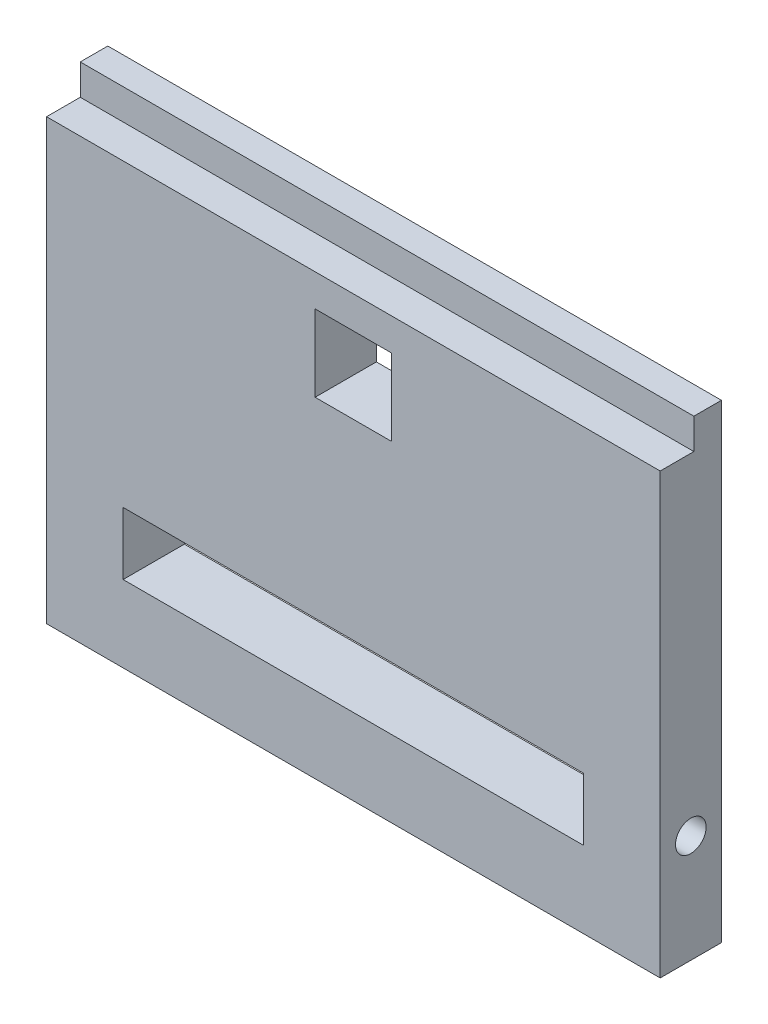
ISO-10303-21;
HEADER;
FILE_DESCRIPTION(('STEP AP214'),'2;1');
FILE_NAME('part.step','',(''),(''),'','','');
FILE_SCHEMA(('AUTOMOTIVE_DESIGN { 1 0 10303 214 1 1 1 1 }'));
ENDSEC;
DATA;
#1=APPLICATION_CONTEXT('core data for automotive mechanical design processes');
#2=APPLICATION_PROTOCOL_DEFINITION('international standard','automotive_design',2000,#1);
#3=PRODUCT_CONTEXT('',#1,'mechanical');
#4=PRODUCT('Part','Part','',(#3));
#5=PRODUCT_RELATED_PRODUCT_CATEGORY('part','',(#4));
#6=PRODUCT_DEFINITION_FORMATION('','',#4);
#7=PRODUCT_DEFINITION_CONTEXT('part definition',#1,'design');
#8=PRODUCT_DEFINITION('design','',#6,#7);
#9=PRODUCT_DEFINITION_SHAPE('','',#8);
#10=(LENGTH_UNIT() NAMED_UNIT(*) SI_UNIT(.MILLI.,.METRE.));
#11=(NAMED_UNIT(*) PLANE_ANGLE_UNIT() SI_UNIT($,.RADIAN.));
#12=(NAMED_UNIT(*) SI_UNIT($,.STERADIAN.) SOLID_ANGLE_UNIT());
#13=UNCERTAINTY_MEASURE_WITH_UNIT(LENGTH_MEASURE(1.E-05),#10,'distance_accuracy_value','');
#14=(GEOMETRIC_REPRESENTATION_CONTEXT(3) GLOBAL_UNCERTAINTY_ASSIGNED_CONTEXT((#13)) GLOBAL_UNIT_ASSIGNED_CONTEXT((#10,
#11,#12)) REPRESENTATION_CONTEXT('',''));
#15=CARTESIAN_POINT('',(0.,0.,0.));
#16=DIRECTION('',(0.,0.,1.));
#17=DIRECTION('',(1.,0.,0.));
#18=AXIS2_PLACEMENT_3D('',#15,#16,#17);
#19=CARTESIAN_POINT('',(0.,0.,10.));
#20=DIRECTION('',(0.,0.,1.));
#21=DIRECTION('',(1.,0.,0.));
#22=AXIS2_PLACEMENT_3D('',#19,#20,#21);
#23=PLANE('',#22);
#24=DIRECTION('',(1.,0.,0.));
#25=VECTOR('',#24,1.);
#26=CARTESIAN_POINT('',(-100.2,108.2,10.));
#27=LINE('',#26,#25);
#28=CARTESIAN_POINT('',(-100.2,108.2,10.));
#29=VERTEX_POINT('',#28);
#30=CARTESIAN_POINT('',(100.2,108.2,10.));
#31=VERTEX_POINT('',#30);
#32=EDGE_CURVE('E149',#29,#31,#27,.T.);
#33=ORIENTED_EDGE('',*,*,#32,.F.);
#34=DIRECTION('',(0.,-1.,0.));
#35=VECTOR('',#34,1.);
#36=CARTESIAN_POINT('',(-100.2,-35.2,10.));
#37=LINE('',#36,#35);
#38=CARTESIAN_POINT('',(-100.2,-35.2,10.));
#39=VERTEX_POINT('',#38);
#40=EDGE_CURVE('E236',#29,#39,#37,.T.);
#41=ORIENTED_EDGE('',*,*,#40,.T.);
#42=DIRECTION('',(1.,0.,0.));
#43=VECTOR('',#42,1.);
#44=CARTESIAN_POINT('',(-100.2,-35.2,10.));
#45=LINE('',#44,#43);
#46=CARTESIAN_POINT('',(100.2,-35.2,10.));
#47=VERTEX_POINT('',#46);
#48=EDGE_CURVE('E230',#39,#47,#45,.T.);
#49=ORIENTED_EDGE('',*,*,#48,.T.);
#50=DIRECTION('',(0.,1.,0.));
#51=VECTOR('',#50,1.);
#52=CARTESIAN_POINT('',(100.2,-35.2,10.));
#53=LINE('',#52,#51);
#54=EDGE_CURVE('E233',#47,#31,#53,.T.);
#55=ORIENTED_EDGE('',*,*,#54,.T.);
#56=EDGE_LOOP('',(#33,#41,#49,#55));
#57=FACE_BOUND('',#56,.T.);
#58=DIRECTION('',(0.,1.,0.));
#59=VECTOR('',#58,1.);
#60=CARTESIAN_POINT('',(12.5,0.,10.));
#61=LINE('',#60,#59);
#62=CARTESIAN_POINT('',(12.5,72.7000000000001,10.));
#63=VERTEX_POINT('',#62);
#64=CARTESIAN_POINT('',(12.5,97.7000000000001,10.));
#65=VERTEX_POINT('',#64);
#66=EDGE_CURVE('E190',#63,#65,#61,.T.);
#67=ORIENTED_EDGE('',*,*,#66,.F.);
#68=DIRECTION('',(1.,0.,0.));
#69=VECTOR('',#68,1.);
#70=CARTESIAN_POINT('',(0.,72.7000000000001,10.));
#71=LINE('',#70,#69);
#72=CARTESIAN_POINT('',(-12.5,72.7000000000001,10.));
#73=VERTEX_POINT('',#72);
#74=EDGE_CURVE('E188',#73,#63,#71,.T.);
#75=ORIENTED_EDGE('',*,*,#74,.F.);
#76=DIRECTION('',(0.,-1.,0.));
#77=VECTOR('',#76,1.);
#78=CARTESIAN_POINT('',(-12.5,0.,10.));
#79=LINE('',#78,#77);
#80=CARTESIAN_POINT('',(-12.5,97.7000000000001,10.));
#81=VERTEX_POINT('',#80);
#82=EDGE_CURVE('E186',#81,#73,#79,.T.);
#83=ORIENTED_EDGE('',*,*,#82,.F.);
#84=DIRECTION('',(-1.,0.,0.));
#85=VECTOR('',#84,1.);
#86=CARTESIAN_POINT('',(0.,97.7000000000001,10.));
#87=LINE('',#86,#85);
#88=EDGE_CURVE('E177',#65,#81,#87,.T.);
#89=ORIENTED_EDGE('',*,*,#88,.F.);
#90=EDGE_LOOP('',(#67,#75,#83,#89));
#91=FACE_BOUND('',#90,.T.);
#92=DIRECTION('',(1.,0.,0.));
#93=VECTOR('',#92,1.);
#94=CARTESIAN_POINT('',(-75.2,-10.2,10.));
#95=LINE('',#94,#93);
#96=CARTESIAN_POINT('',(-75.2,-10.2,10.));
#97=VERTEX_POINT('',#96);
#98=CARTESIAN_POINT('',(75.2,-10.2,10.));
#99=VERTEX_POINT('',#98);
#100=EDGE_CURVE('E201',#97,#99,#95,.T.);
#101=ORIENTED_EDGE('',*,*,#100,.F.);
#102=DIRECTION('',(0.,-1.,0.));
#103=VECTOR('',#102,1.);
#104=CARTESIAN_POINT('',(-75.2,-10.2,10.));
#105=LINE('',#104,#103);
#106=CARTESIAN_POINT('',(-75.2,10.2,10.));
#107=VERTEX_POINT('',#106);
#108=EDGE_CURVE('E199',#107,#97,#105,.T.);
#109=ORIENTED_EDGE('',*,*,#108,.F.);
#110=DIRECTION('',(-1.,0.,0.));
#111=VECTOR('',#110,1.);
#112=CARTESIAN_POINT('',(-75.2,10.2,10.));
#113=LINE('',#112,#111);
#114=CARTESIAN_POINT('',(75.2,10.2,10.));
#115=VERTEX_POINT('',#114);
#116=EDGE_CURVE('E207',#115,#107,#113,.T.);
#117=ORIENTED_EDGE('',*,*,#116,.F.);
#118=DIRECTION('',(0.,1.,0.));
#119=VECTOR('',#118,1.);
#120=CARTESIAN_POINT('',(75.2,-10.2,10.));
#121=LINE('',#120,#119);
#122=EDGE_CURVE('E204',#99,#115,#121,.T.);
#123=ORIENTED_EDGE('',*,*,#122,.F.);
#124=EDGE_LOOP('',(#101,#109,#117,#123));
#125=FACE_BOUND('',#124,.T.);
#126=ADVANCED_FACE('F37',(#57,#91,#125),#23,.T.);
#127=CARTESIAN_POINT('',(0.,0.,-10.));
#128=DIRECTION('',(0.,0.,1.));
#129=DIRECTION('',(1.,0.,0.));
#130=AXIS2_PLACEMENT_3D('',#127,#128,#129);
#131=PLANE('',#130);
#132=DIRECTION('',(1.,0.,0.));
#133=VECTOR('',#132,1.);
#134=CARTESIAN_POINT('',(-12.5,72.7000000000001,-10.));
#135=LINE('',#134,#133);
#136=CARTESIAN_POINT('',(-12.5,72.7000000000001,-10.));
#137=VERTEX_POINT('',#136);
#138=CARTESIAN_POINT('',(12.5,72.7000000000001,-10.));
#139=VERTEX_POINT('',#138);
#140=EDGE_CURVE('E171',#137,#139,#135,.T.);
#141=ORIENTED_EDGE('',*,*,#140,.T.);
#142=DIRECTION('',(0.,1.,0.));
#143=VECTOR('',#142,1.);
#144=CARTESIAN_POINT('',(12.5,72.7000000000001,-10.));
#145=LINE('',#144,#143);
#146=CARTESIAN_POINT('',(12.5,97.7000000000001,-10.));
#147=VERTEX_POINT('',#146);
#148=EDGE_CURVE('E158',#139,#147,#145,.T.);
#149=ORIENTED_EDGE('',*,*,#148,.T.);
#150=DIRECTION('',(-1.,0.,0.));
#151=VECTOR('',#150,1.);
#152=CARTESIAN_POINT('',(12.5,97.7000000000001,-10.));
#153=LINE('',#152,#151);
#154=CARTESIAN_POINT('',(-12.5,97.7000000000001,-10.));
#155=VERTEX_POINT('',#154);
#156=EDGE_CURVE('E165',#147,#155,#153,.T.);
#157=ORIENTED_EDGE('',*,*,#156,.T.);
#158=DIRECTION('',(0.,-1.,0.));
#159=VECTOR('',#158,1.);
#160=CARTESIAN_POINT('',(-12.5,97.7000000000001,-10.));
#161=LINE('',#160,#159);
#162=EDGE_CURVE('E168',#155,#137,#161,.T.);
#163=ORIENTED_EDGE('',*,*,#162,.T.);
#164=EDGE_LOOP('',(#141,#149,#157,#163));
#165=FACE_BOUND('',#164,.T.);
#166=DIRECTION('',(1.,0.,0.));
#167=VECTOR('',#166,1.);
#168=CARTESIAN_POINT('',(-100.2,-35.2,-10.));
#169=LINE('',#168,#167);
#170=CARTESIAN_POINT('',(-100.2,-35.2,-10.));
#171=VERTEX_POINT('',#170);
#172=CARTESIAN_POINT('',(100.2,-35.2,-10.));
#173=VERTEX_POINT('',#172);
#174=EDGE_CURVE('E229',#171,#173,#169,.T.);
#175=ORIENTED_EDGE('',*,*,#174,.F.);
#176=DIRECTION('',(0.,-1.,0.));
#177=VECTOR('',#176,1.);
#178=CARTESIAN_POINT('',(-100.2,-35.2,-10.));
#179=LINE('',#178,#177);
#180=CARTESIAN_POINT('',(-100.2,118.2,-10.));
#181=VERTEX_POINT('',#180);
#182=EDGE_CURVE('E234',#181,#171,#179,.T.);
#183=ORIENTED_EDGE('',*,*,#182,.F.);
#184=DIRECTION('',(-1.,0.,0.));
#185=VECTOR('',#184,1.);
#186=CARTESIAN_POINT('',(-100.2,118.2,-10.));
#187=LINE('',#186,#185);
#188=CARTESIAN_POINT('',(100.2,118.2,-10.));
#189=VERTEX_POINT('',#188);
#190=EDGE_CURVE('E243',#189,#181,#187,.T.);
#191=ORIENTED_EDGE('',*,*,#190,.F.);
#192=DIRECTION('',(0.,1.,0.));
#193=VECTOR('',#192,1.);
#194=CARTESIAN_POINT('',(100.2,-35.2,-10.));
#195=LINE('',#194,#193);
#196=EDGE_CURVE('E241',#173,#189,#195,.T.);
#197=ORIENTED_EDGE('',*,*,#196,.F.);
#198=EDGE_LOOP('',(#175,#183,#191,#197));
#199=FACE_BOUND('',#198,.T.);
#200=DIRECTION('',(0.,-1.,0.));
#201=VECTOR('',#200,1.);
#202=CARTESIAN_POINT('',(-75.2,-10.2,-10.));
#203=LINE('',#202,#201);
#204=CARTESIAN_POINT('',(-75.2,10.2,-10.));
#205=VERTEX_POINT('',#204);
#206=CARTESIAN_POINT('',(-75.2,-10.2,-10.));
#207=VERTEX_POINT('',#206);
#208=EDGE_CURVE('E196',#205,#207,#203,.T.);
#209=ORIENTED_EDGE('',*,*,#208,.T.);
#210=DIRECTION('',(1.,0.,0.));
#211=VECTOR('',#210,1.);
#212=CARTESIAN_POINT('',(-75.2,-10.2,-10.));
#213=LINE('',#212,#211);
#214=CARTESIAN_POINT('',(75.2,-10.2,-10.));
#215=VERTEX_POINT('',#214);
#216=EDGE_CURVE('E212',#207,#215,#213,.T.);
#217=ORIENTED_EDGE('',*,*,#216,.T.);
#218=DIRECTION('',(0.,1.,0.));
#219=VECTOR('',#218,1.);
#220=CARTESIAN_POINT('',(75.2,-10.2,-10.));
#221=LINE('',#220,#219);
#222=CARTESIAN_POINT('',(75.2,10.2,-10.));
#223=VERTEX_POINT('',#222);
#224=EDGE_CURVE('E215',#215,#223,#221,.T.);
#225=ORIENTED_EDGE('',*,*,#224,.T.);
#226=DIRECTION('',(-1.,0.,0.));
#227=VECTOR('',#226,1.);
#228=CARTESIAN_POINT('',(-75.2,10.2,-10.));
#229=LINE('',#228,#227);
#230=EDGE_CURVE('E202',#223,#205,#229,.T.);
#231=ORIENTED_EDGE('',*,*,#230,.T.);
#232=EDGE_LOOP('',(#209,#217,#225,#231));
#233=FACE_BOUND('',#232,.T.);
#234=ADVANCED_FACE('F258',(#165,#199,#233),#131,.F.);
#235=CARTESIAN_POINT('',(-100.2,-35.2,10.));
#236=DIRECTION('',(0.,1.,0.));
#237=DIRECTION('',(0.,0.,1.));
#238=AXIS2_PLACEMENT_3D('',#235,#236,#237);
#239=PLANE('',#238);
#240=ORIENTED_EDGE('',*,*,#174,.T.);
#241=DIRECTION('',(0.,0.,-1.));
#242=VECTOR('',#241,1.);
#243=CARTESIAN_POINT('',(100.2,-35.2,10.));
#244=LINE('',#243,#242);
#245=EDGE_CURVE('E12',#47,#173,#244,.T.);
#246=ORIENTED_EDGE('',*,*,#245,.F.);
#247=ORIENTED_EDGE('',*,*,#48,.F.);
#248=DIRECTION('',(0.,0.,-1.));
#249=VECTOR('',#248,1.);
#250=CARTESIAN_POINT('',(-100.2,-35.2,10.));
#251=LINE('',#250,#249);
#252=EDGE_CURVE('E238',#39,#171,#251,.T.);
#253=ORIENTED_EDGE('',*,*,#252,.T.);
#254=EDGE_LOOP('',(#240,#246,#247,#253));
#255=FACE_BOUND('',#254,.T.);
#256=ADVANCED_FACE('F39',(#255),#239,.F.);
#257=CARTESIAN_POINT('',(100.2,-35.2,10.));
#258=DIRECTION('',(-1.,0.,0.));
#259=DIRECTION('',(0.,0.,1.));
#260=AXIS2_PLACEMENT_3D('',#257,#258,#259);
#261=PLANE('',#260);
#262=CARTESIAN_POINT('',(100.2,0.,0.));
#263=DIRECTION('',(1.,0.,0.));
#264=DIRECTION('',(0.,0.,-1.));
#265=AXIS2_PLACEMENT_3D('',#262,#263,#264);
#266=CIRCLE('',#265,5.);
#267=CARTESIAN_POINT('',(100.2,0.,-5.));
#268=VERTEX_POINT('',#267);
#269=EDGE_CURVE('E193',#268,#268,#266,.T.);
#270=ORIENTED_EDGE('',*,*,#269,.F.);
#271=EDGE_LOOP('',(#270));
#272=FACE_BOUND('',#271,.T.);
#273=DIRECTION('',(0.,0.,-1.));
#274=VECTOR('',#273,1.);
#275=CARTESIAN_POINT('',(100.2,118.2,10.));
#276=LINE('',#275,#274);
#277=CARTESIAN_POINT('',(100.2,118.2,-0.999999999999977));
#278=VERTEX_POINT('',#277);
#279=EDGE_CURVE('E45',#278,#189,#276,.T.);
#280=ORIENTED_EDGE('',*,*,#279,.F.);
#281=DIRECTION('',(0.,1.,0.));
#282=VECTOR('',#281,1.);
#283=CARTESIAN_POINT('',(100.2,108.2,-0.999999999999977));
#284=LINE('',#283,#282);
#285=CARTESIAN_POINT('',(100.2,108.2,-0.999999999999977));
#286=VERTEX_POINT('',#285);
#287=EDGE_CURVE('E138',#286,#278,#284,.T.);
#288=ORIENTED_EDGE('',*,*,#287,.F.);
#289=DIRECTION('',(0.,0.,-1.));
#290=VECTOR('',#289,1.);
#291=CARTESIAN_POINT('',(100.2,108.2,10.));
#292=LINE('',#291,#290);
#293=EDGE_CURVE('E144',#31,#286,#292,.T.);
#294=ORIENTED_EDGE('',*,*,#293,.F.);
#295=ORIENTED_EDGE('',*,*,#54,.F.);
#296=ORIENTED_EDGE('',*,*,#245,.T.);
#297=ORIENTED_EDGE('',*,*,#196,.T.);
#298=EDGE_LOOP('',(#280,#288,#294,#295,#296,#297));
#299=FACE_BOUND('',#298,.T.);
#300=ADVANCED_FACE('F155',(#272,#299),#261,.F.);
#301=CARTESIAN_POINT('',(-100.2,118.2,10.));
#302=DIRECTION('',(0.,-1.,0.));
#303=DIRECTION('',(0.,0.,-1.));
#304=AXIS2_PLACEMENT_3D('',#301,#302,#303);
#305=PLANE('',#304);
#306=DIRECTION('',(0.,0.,-1.));
#307=VECTOR('',#306,1.);
#308=CARTESIAN_POINT('',(-100.2,118.2,10.));
#309=LINE('',#308,#307);
#310=CARTESIAN_POINT('',(-100.2,118.2,-0.999999999999977));
#311=VERTEX_POINT('',#310);
#312=EDGE_CURVE('E249',#311,#181,#309,.T.);
#313=ORIENTED_EDGE('',*,*,#312,.F.);
#314=DIRECTION('',(-1.,0.,0.));
#315=VECTOR('',#314,1.);
#316=CARTESIAN_POINT('',(-100.2,118.2,-0.999999999999977));
#317=LINE('',#316,#315);
#318=EDGE_CURVE('E152',#278,#311,#317,.T.);
#319=ORIENTED_EDGE('',*,*,#318,.F.);
#320=ORIENTED_EDGE('',*,*,#279,.T.);
#321=ORIENTED_EDGE('',*,*,#190,.T.);
#322=EDGE_LOOP('',(#313,#319,#320,#321));
#323=FACE_BOUND('',#322,.T.);
#324=ADVANCED_FACE('F252',(#323),#305,.F.);
#325=CARTESIAN_POINT('',(-100.2,-35.2,10.));
#326=DIRECTION('',(1.,0.,0.));
#327=DIRECTION('',(0.,0.,-1.));
#328=AXIS2_PLACEMENT_3D('',#325,#326,#327);
#329=PLANE('',#328);
#330=DIRECTION('',(0.,0.,1.));
#331=VECTOR('',#330,1.);
#332=CARTESIAN_POINT('',(-100.2,108.2,10.));
#333=LINE('',#332,#331);
#334=CARTESIAN_POINT('',(-100.2,108.2,-0.999999999999977));
#335=VERTEX_POINT('',#334);
#336=EDGE_CURVE('E143',#335,#29,#333,.T.);
#337=ORIENTED_EDGE('',*,*,#336,.F.);
#338=DIRECTION('',(0.,1.,0.));
#339=VECTOR('',#338,1.);
#340=CARTESIAN_POINT('',(-100.2,108.2,-0.999999999999977));
#341=LINE('',#340,#339);
#342=EDGE_CURVE('E141',#335,#311,#341,.T.);
#343=ORIENTED_EDGE('',*,*,#342,.T.);
#344=ORIENTED_EDGE('',*,*,#312,.T.);
#345=ORIENTED_EDGE('',*,*,#182,.T.);
#346=ORIENTED_EDGE('',*,*,#252,.F.);
#347=ORIENTED_EDGE('',*,*,#40,.F.);
#348=EDGE_LOOP('',(#337,#343,#344,#345,#346,#347));
#349=FACE_BOUND('',#348,.T.);
#350=ADVANCED_FACE('F262',(#349),#329,.F.);
#351=CARTESIAN_POINT('',(-75.2,-10.2,10.));
#352=DIRECTION('',(1.,0.,0.));
#353=DIRECTION('',(0.,0.,-1.));
#354=AXIS2_PLACEMENT_3D('',#351,#352,#353);
#355=PLANE('',#354);
#356=ORIENTED_EDGE('',*,*,#208,.F.);
#357=DIRECTION('',(0.,0.,-1.));
#358=VECTOR('',#357,1.);
#359=CARTESIAN_POINT('',(-75.2,10.2,10.));
#360=LINE('',#359,#358);
#361=EDGE_CURVE('E209',#107,#205,#360,.T.);
#362=ORIENTED_EDGE('',*,*,#361,.F.);
#363=ORIENTED_EDGE('',*,*,#108,.T.);
#364=DIRECTION('',(0.,0.,-1.));
#365=VECTOR('',#364,1.);
#366=CARTESIAN_POINT('',(-75.2,-10.2,10.));
#367=LINE('',#366,#365);
#368=EDGE_CURVE('E226',#97,#207,#367,.T.);
#369=ORIENTED_EDGE('',*,*,#368,.T.);
#370=EDGE_LOOP('',(#356,#362,#363,#369));
#371=FACE_BOUND('',#370,.T.);
#372=ADVANCED_FACE('F288',(#371),#355,.T.);
#373=CARTESIAN_POINT('',(-75.2,-10.2,10.));
#374=DIRECTION('',(0.,1.,0.));
#375=DIRECTION('',(0.,0.,1.));
#376=AXIS2_PLACEMENT_3D('',#373,#374,#375);
#377=PLANE('',#376);
#378=ORIENTED_EDGE('',*,*,#216,.F.);
#379=ORIENTED_EDGE('',*,*,#368,.F.);
#380=ORIENTED_EDGE('',*,*,#100,.T.);
#381=DIRECTION('',(0.,0.,-1.));
#382=VECTOR('',#381,1.);
#383=CARTESIAN_POINT('',(75.2,-10.2,10.));
#384=LINE('',#383,#382);
#385=EDGE_CURVE('E224',#99,#215,#384,.T.);
#386=ORIENTED_EDGE('',*,*,#385,.T.);
#387=EDGE_LOOP('',(#378,#379,#380,#386));
#388=FACE_BOUND('',#387,.T.);
#389=ADVANCED_FACE('F282',(#388),#377,.T.);
#390=CARTESIAN_POINT('',(75.2,-10.2,10.));
#391=DIRECTION('',(-1.,0.,0.));
#392=DIRECTION('',(0.,0.,1.));
#393=AXIS2_PLACEMENT_3D('',#390,#391,#392);
#394=PLANE('',#393);
#395=CARTESIAN_POINT('',(75.2,0.,0.));
#396=DIRECTION('',(-1.,0.,0.));
#397=DIRECTION('',(0.,0.,1.));
#398=AXIS2_PLACEMENT_3D('',#395,#396,#397);
#399=CIRCLE('',#398,5.);
#400=CARTESIAN_POINT('',(75.2,0.,5.));
#401=VERTEX_POINT('',#400);
#402=EDGE_CURVE('E192',#401,#401,#399,.F.);
#403=ORIENTED_EDGE('',*,*,#402,.T.);
#404=EDGE_LOOP('',(#403));
#405=FACE_BOUND('',#404,.T.);
#406=ORIENTED_EDGE('',*,*,#224,.F.);
#407=ORIENTED_EDGE('',*,*,#385,.F.);
#408=ORIENTED_EDGE('',*,*,#122,.T.);
#409=DIRECTION('',(0.,0.,-1.));
#410=VECTOR('',#409,1.);
#411=CARTESIAN_POINT('',(75.2,10.2,10.));
#412=LINE('',#411,#410);
#413=EDGE_CURVE('E222',#115,#223,#412,.T.);
#414=ORIENTED_EDGE('',*,*,#413,.T.);
#415=EDGE_LOOP('',(#406,#407,#408,#414));
#416=FACE_BOUND('',#415,.T.);
#417=ADVANCED_FACE('F285',(#405,#416),#394,.T.);
#418=CARTESIAN_POINT('',(-75.2,10.2,10.));
#419=DIRECTION('',(0.,-1.,0.));
#420=DIRECTION('',(0.,0.,-1.));
#421=AXIS2_PLACEMENT_3D('',#418,#419,#420);
#422=PLANE('',#421);
#423=ORIENTED_EDGE('',*,*,#230,.F.);
#424=ORIENTED_EDGE('',*,*,#413,.F.);
#425=ORIENTED_EDGE('',*,*,#116,.T.);
#426=ORIENTED_EDGE('',*,*,#361,.T.);
#427=EDGE_LOOP('',(#423,#424,#425,#426));
#428=FACE_BOUND('',#427,.T.);
#429=ADVANCED_FACE('F291',(#428),#422,.T.);
#430=CARTESIAN_POINT('',(-100.201,0.,0.));
#431=DIRECTION('',(1.,0.,0.));
#432=DIRECTION('',(0.,0.,-1.));
#433=AXIS2_PLACEMENT_3D('',#430,#431,#432);
#434=CYLINDRICAL_SURFACE('',#433,5.);
#435=ORIENTED_EDGE('',*,*,#402,.F.);
#436=EDGE_LOOP('',(#435));
#437=FACE_BOUND('',#436,.T.);
#438=ORIENTED_EDGE('',*,*,#269,.T.);
#439=EDGE_LOOP('',(#438));
#440=FACE_BOUND('',#439,.T.);
#441=ADVANCED_FACE('F293',(#437,#440),#434,.F.);
#442=CARTESIAN_POINT('',(12.5,72.7000000000001,-10.));
#443=DIRECTION('',(1.,0.,0.));
#444=DIRECTION('',(0.,0.,-1.));
#445=AXIS2_PLACEMENT_3D('',#442,#443,#444);
#446=PLANE('',#445);
#447=ORIENTED_EDGE('',*,*,#66,.T.);
#448=DIRECTION('',(0.,0.,1.));
#449=VECTOR('',#448,1.);
#450=CARTESIAN_POINT('',(12.5,97.7000000000001,-10.));
#451=LINE('',#450,#449);
#452=EDGE_CURVE('E60',#147,#65,#451,.T.);
#453=ORIENTED_EDGE('',*,*,#452,.F.);
#454=ORIENTED_EDGE('',*,*,#148,.F.);
#455=DIRECTION('',(0.,0.,1.));
#456=VECTOR('',#455,1.);
#457=CARTESIAN_POINT('',(12.5,72.7000000000001,-10.));
#458=LINE('',#457,#456);
#459=EDGE_CURVE('E174',#139,#63,#458,.T.);
#460=ORIENTED_EDGE('',*,*,#459,.T.);
#461=EDGE_LOOP('',(#447,#453,#454,#460));
#462=FACE_BOUND('',#461,.T.);
#463=ADVANCED_FACE('F299',(#462),#446,.F.);
#464=CARTESIAN_POINT('',(-12.5,72.7000000000001,-10.));
#465=DIRECTION('',(0.,-1.,0.));
#466=DIRECTION('',(0.,0.,-1.));
#467=AXIS2_PLACEMENT_3D('',#464,#465,#466);
#468=PLANE('',#467);
#469=ORIENTED_EDGE('',*,*,#74,.T.);
#470=ORIENTED_EDGE('',*,*,#459,.F.);
#471=ORIENTED_EDGE('',*,*,#140,.F.);
#472=DIRECTION('',(0.,0.,1.));
#473=VECTOR('',#472,1.);
#474=CARTESIAN_POINT('',(-12.5,72.7000000000001,-10.));
#475=LINE('',#474,#473);
#476=EDGE_CURVE('E178',#137,#73,#475,.T.);
#477=ORIENTED_EDGE('',*,*,#476,.T.);
#478=EDGE_LOOP('',(#469,#470,#471,#477));
#479=FACE_BOUND('',#478,.T.);
#480=ADVANCED_FACE('F385',(#479),#468,.F.);
#481=CARTESIAN_POINT('',(-12.5,97.7000000000001,-10.));
#482=DIRECTION('',(-1.,0.,0.));
#483=DIRECTION('',(0.,0.,1.));
#484=AXIS2_PLACEMENT_3D('',#481,#482,#483);
#485=PLANE('',#484);
#486=ORIENTED_EDGE('',*,*,#82,.T.);
#487=ORIENTED_EDGE('',*,*,#476,.F.);
#488=ORIENTED_EDGE('',*,*,#162,.F.);
#489=DIRECTION('',(0.,0.,1.));
#490=VECTOR('',#489,1.);
#491=CARTESIAN_POINT('',(-12.5,97.7000000000001,-10.));
#492=LINE('',#491,#490);
#493=EDGE_CURVE('E181',#155,#81,#492,.T.);
#494=ORIENTED_EDGE('',*,*,#493,.T.);
#495=EDGE_LOOP('',(#486,#487,#488,#494));
#496=FACE_BOUND('',#495,.T.);
#497=ADVANCED_FACE('F395',(#496),#485,.F.);
#498=CARTESIAN_POINT('',(12.5,97.7000000000001,-10.));
#499=DIRECTION('',(0.,1.,0.));
#500=DIRECTION('',(0.,0.,1.));
#501=AXIS2_PLACEMENT_3D('',#498,#499,#500);
#502=PLANE('',#501);
#503=ORIENTED_EDGE('',*,*,#88,.T.);
#504=ORIENTED_EDGE('',*,*,#493,.F.);
#505=ORIENTED_EDGE('',*,*,#156,.F.);
#506=ORIENTED_EDGE('',*,*,#452,.T.);
#507=EDGE_LOOP('',(#503,#504,#505,#506));
#508=FACE_BOUND('',#507,.T.);
#509=ADVANCED_FACE('F406',(#508),#502,.F.);
#510=CARTESIAN_POINT('',(-100.2,108.2,-0.999999999999977));
#511=DIRECTION('',(0.,0.,-1.));
#512=DIRECTION('',(-1.,0.,0.));
#513=AXIS2_PLACEMENT_3D('',#510,#511,#512);
#514=PLANE('',#513);
#515=ORIENTED_EDGE('',*,*,#318,.T.);
#516=ORIENTED_EDGE('',*,*,#342,.F.);
#517=DIRECTION('',(-1.,0.,0.));
#518=VECTOR('',#517,1.);
#519=CARTESIAN_POINT('',(-100.2,108.2,-0.999999999999977));
#520=LINE('',#519,#518);
#521=EDGE_CURVE('E52',#286,#335,#520,.T.);
#522=ORIENTED_EDGE('',*,*,#521,.F.);
#523=ORIENTED_EDGE('',*,*,#287,.T.);
#524=EDGE_LOOP('',(#515,#516,#522,#523));
#525=FACE_BOUND('',#524,.T.);
#526=ADVANCED_FACE('F136',(#525),#514,.F.);
#527=CARTESIAN_POINT('',(0.,108.2,0.));
#528=DIRECTION('',(0.,-1.,0.));
#529=DIRECTION('',(0.,0.,-1.));
#530=AXIS2_PLACEMENT_3D('',#527,#528,#529);
#531=PLANE('',#530);
#532=ORIENTED_EDGE('',*,*,#293,.T.);
#533=ORIENTED_EDGE('',*,*,#521,.T.);
#534=ORIENTED_EDGE('',*,*,#336,.T.);
#535=ORIENTED_EDGE('',*,*,#32,.T.);
#536=EDGE_LOOP('',(#532,#533,#534,#535));
#537=FACE_BOUND('',#536,.T.);
#538=ADVANCED_FACE('F147',(#537),#531,.F.);
#539=CLOSED_SHELL('',(#126,#234,#256,#300,#324,#350,#372,#389,#417,#429,#441,#463,#480,#497,
#509,#526,#538));
#540=MANIFOLD_SOLID_BREP('B2',#539);
#541=ADVANCED_BREP_SHAPE_REPRESENTATION('',(#18,#540),#14);
#542=SHAPE_DEFINITION_REPRESENTATION(#9,#541);
ENDSEC;
END-ISO-10303-21;
